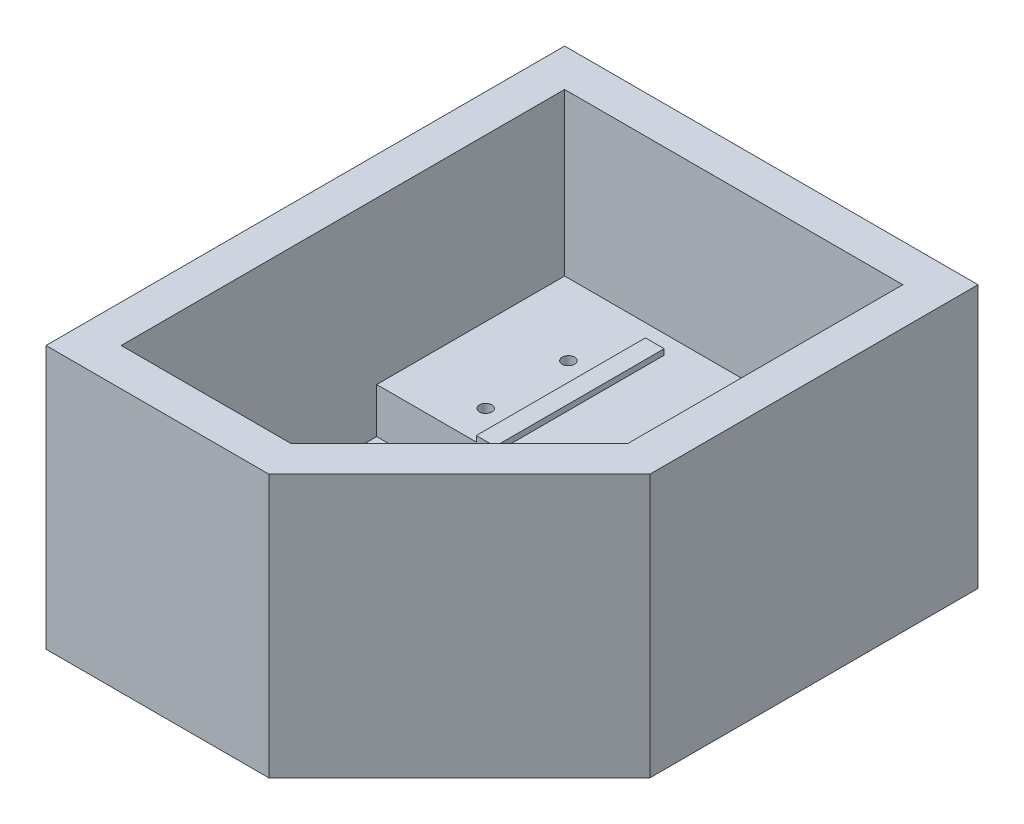
ISO-10303-21;
HEADER;
FILE_DESCRIPTION(('STEP AP214'),'2;1');
FILE_NAME('part.step','',(''),(''),'','','');
FILE_SCHEMA(('AUTOMOTIVE_DESIGN { 1 0 10303 214 1 1 1 1 }'));
ENDSEC;
DATA;
#1=APPLICATION_CONTEXT('core data for automotive mechanical design processes');
#2=APPLICATION_PROTOCOL_DEFINITION('international standard','automotive_design',2000,#1);
#3=PRODUCT_CONTEXT('',#1,'mechanical');
#4=PRODUCT('Part','Part','',(#3));
#5=PRODUCT_RELATED_PRODUCT_CATEGORY('part','',(#4));
#6=PRODUCT_DEFINITION_FORMATION('','',#4);
#7=PRODUCT_DEFINITION_CONTEXT('part definition',#1,'design');
#8=PRODUCT_DEFINITION('design','',#6,#7);
#9=PRODUCT_DEFINITION_SHAPE('','',#8);
#10=(LENGTH_UNIT() NAMED_UNIT(*) SI_UNIT(.MILLI.,.METRE.));
#11=(NAMED_UNIT(*) PLANE_ANGLE_UNIT() SI_UNIT($,.RADIAN.));
#12=(NAMED_UNIT(*) SI_UNIT($,.STERADIAN.) SOLID_ANGLE_UNIT());
#13=UNCERTAINTY_MEASURE_WITH_UNIT(LENGTH_MEASURE(1.E-05),#10,'distance_accuracy_value','');
#14=(GEOMETRIC_REPRESENTATION_CONTEXT(3) GLOBAL_UNCERTAINTY_ASSIGNED_CONTEXT((#13)) GLOBAL_UNIT_ASSIGNED_CONTEXT((#10,
#11,#12)) REPRESENTATION_CONTEXT('',''));
#15=CARTESIAN_POINT('',(0.,0.,0.));
#16=DIRECTION('',(0.,0.,1.));
#17=DIRECTION('',(1.,0.,0.));
#18=AXIS2_PLACEMENT_3D('',#15,#16,#17);
#19=CARTESIAN_POINT('',(0.,27.,0.));
#20=DIRECTION('',(0.,1.,0.));
#21=DIRECTION('',(0.,0.,1.));
#22=AXIS2_PLACEMENT_3D('',#19,#20,#21);
#23=PLANE('',#22);
#24=CARTESIAN_POINT('',(-25.,27.,-40.));
#25=DIRECTION('',(0.,1.,0.));
#26=DIRECTION('',(0.,0.,1.));
#27=AXIS2_PLACEMENT_3D('',#24,#25,#26);
#28=CIRCLE('',#27,1.64999999999999);
#29=CARTESIAN_POINT('',(-25.,27.,-38.35));
#30=VERTEX_POINT('',#29);
#31=EDGE_CURVE('E272',#30,#30,#28,.T.);
#32=ORIENTED_EDGE('',*,*,#31,.F.);
#33=EDGE_LOOP('',(#32));
#34=FACE_BOUND('',#33,.T.);
#35=CARTESIAN_POINT('',(25.,27.,-40.));
#36=DIRECTION('',(0.,1.,0.));
#37=DIRECTION('',(0.,0.,1.));
#38=AXIS2_PLACEMENT_3D('',#35,#36,#37);
#39=CIRCLE('',#38,1.64999999999999);
#40=CARTESIAN_POINT('',(25.,27.,-38.35));
#41=VERTEX_POINT('',#40);
#42=EDGE_CURVE('E278',#41,#41,#39,.T.);
#43=ORIENTED_EDGE('',*,*,#42,.F.);
#44=EDGE_LOOP('',(#43));
#45=FACE_BOUND('',#44,.T.);
#46=CARTESIAN_POINT('',(25.,27.,-18.));
#47=DIRECTION('',(0.,1.,0.));
#48=DIRECTION('',(0.,0.,1.));
#49=AXIS2_PLACEMENT_3D('',#46,#47,#48);
#50=CIRCLE('',#49,1.64999999999999);
#51=CARTESIAN_POINT('',(25.,27.,-16.35));
#52=VERTEX_POINT('',#51);
#53=EDGE_CURVE('E284',#52,#52,#50,.T.);
#54=ORIENTED_EDGE('',*,*,#53,.F.);
#55=EDGE_LOOP('',(#54));
#56=FACE_BOUND('',#55,.T.);
#57=CARTESIAN_POINT('',(-25.,27.,-18.));
#58=DIRECTION('',(0.,1.,0.));
#59=DIRECTION('',(0.,0.,1.));
#60=AXIS2_PLACEMENT_3D('',#57,#58,#59);
#61=CIRCLE('',#60,1.64999999999999);
#62=CARTESIAN_POINT('',(-25.,27.,-16.35));
#63=VERTEX_POINT('',#62);
#64=EDGE_CURVE('E290',#63,#63,#61,.T.);
#65=ORIENTED_EDGE('',*,*,#64,.F.);
#66=EDGE_LOOP('',(#65));
#67=FACE_BOUND('',#66,.T.);
#68=DIRECTION('',(-1.,0.,0.));
#69=VECTOR('',#68,1.);
#70=CARTESIAN_POINT('',(18.5,27.,-54.));
#71=LINE('',#70,#69);
#72=CARTESIAN_POINT('',(18.5,27.,-54.));
#73=VERTEX_POINT('',#72);
#74=CARTESIAN_POINT('',(13.5,27.,-54.));
#75=VERTEX_POINT('',#74);
#76=EDGE_CURVE('E56',#73,#75,#71,.T.);
#77=ORIENTED_EDGE('',*,*,#76,.F.);
#78=DIRECTION('',(0.,0.,1.));
#79=VECTOR('',#78,1.);
#80=CARTESIAN_POINT('',(18.5,27.,-54.));
#81=LINE('',#80,#79);
#82=CARTESIAN_POINT('',(18.5,27.,-9.));
#83=VERTEX_POINT('',#82);
#84=EDGE_CURVE('E311',#73,#83,#81,.T.);
#85=ORIENTED_EDGE('',*,*,#84,.T.);
#86=DIRECTION('',(1.,0.,0.));
#87=VECTOR('',#86,1.);
#88=CARTESIAN_POINT('',(-45.,27.,-9.));
#89=LINE('',#88,#87);
#90=CARTESIAN_POINT('',(45.,27.,-9.));
#91=VERTEX_POINT('',#90);
#92=EDGE_CURVE('E359',#83,#91,#89,.T.);
#93=ORIENTED_EDGE('',*,*,#92,.T.);
#94=DIRECTION('',(0.,0.,-1.));
#95=VECTOR('',#94,1.);
#96=CARTESIAN_POINT('',(45.,27.,-59.));
#97=LINE('',#96,#95);
#98=CARTESIAN_POINT('',(45.,27.,-59.));
#99=VERTEX_POINT('',#98);
#100=EDGE_CURVE('E364',#91,#99,#97,.T.);
#101=ORIENTED_EDGE('',*,*,#100,.T.);
#102=DIRECTION('',(-1.,0.,0.));
#103=VECTOR('',#102,1.);
#104=CARTESIAN_POINT('',(-45.,27.,-59.));
#105=LINE('',#104,#103);
#106=CARTESIAN_POINT('',(-45.,27.,-59.));
#107=VERTEX_POINT('',#106);
#108=EDGE_CURVE('E382',#99,#107,#105,.T.);
#109=ORIENTED_EDGE('',*,*,#108,.T.);
#110=DIRECTION('',(0.,0.,1.));
#111=VECTOR('',#110,1.);
#112=CARTESIAN_POINT('',(-45.,27.,-59.));
#113=LINE('',#112,#111);
#114=CARTESIAN_POINT('',(-45.,27.,-9.));
#115=VERTEX_POINT('',#114);
#116=EDGE_CURVE('E345',#107,#115,#113,.T.);
#117=ORIENTED_EDGE('',*,*,#116,.T.);
#118=CARTESIAN_POINT('',(-18.5,27.,-9.));
#119=VERTEX_POINT('',#118);
#120=EDGE_CURVE('E370',#115,#119,#89,.T.);
#121=ORIENTED_EDGE('',*,*,#120,.T.);
#122=DIRECTION('',(0.,0.,1.));
#123=VECTOR('',#122,1.);
#124=CARTESIAN_POINT('',(-18.5,27.,-54.));
#125=LINE('',#124,#123);
#126=CARTESIAN_POINT('',(-18.5,27.,-54.));
#127=VERTEX_POINT('',#126);
#128=EDGE_CURVE('E333',#127,#119,#125,.T.);
#129=ORIENTED_EDGE('',*,*,#128,.F.);
#130=DIRECTION('',(1.,0.,0.));
#131=VECTOR('',#130,1.);
#132=CARTESIAN_POINT('',(-18.5,27.,-54.));
#133=LINE('',#132,#131);
#134=CARTESIAN_POINT('',(-13.5,27.,-54.));
#135=VERTEX_POINT('',#134);
#136=EDGE_CURVE('E323',#127,#135,#133,.T.);
#137=ORIENTED_EDGE('',*,*,#136,.T.);
#138=DIRECTION('',(0.,0.,1.));
#139=VECTOR('',#138,1.);
#140=CARTESIAN_POINT('',(-13.5,27.,-54.));
#141=LINE('',#140,#139);
#142=CARTESIAN_POINT('',(-13.5,27.,-9.));
#143=VERTEX_POINT('',#142);
#144=EDGE_CURVE('E342',#135,#143,#141,.T.);
#145=ORIENTED_EDGE('',*,*,#144,.T.);
#146=CARTESIAN_POINT('',(13.5,27.,-9.));
#147=VERTEX_POINT('',#146);
#148=EDGE_CURVE('E361',#143,#147,#89,.T.);
#149=ORIENTED_EDGE('',*,*,#148,.T.);
#150=DIRECTION('',(0.,0.,1.));
#151=VECTOR('',#150,1.);
#152=CARTESIAN_POINT('',(13.5,27.,-54.));
#153=LINE('',#152,#151);
#154=EDGE_CURVE('E61',#75,#147,#153,.T.);
#155=ORIENTED_EDGE('',*,*,#154,.F.);
#156=EDGE_LOOP('',(#77,#85,#93,#101,#109,#117,#121,#129,#137,#145,#149,#155));
#157=FACE_BOUND('',#156,.T.);
#158=ADVANCED_FACE('F38',(#34,#45,#56,#67,#157),#23,.T.);
#159=CARTESIAN_POINT('',(0.,15.,0.));
#160=DIRECTION('',(0.,-1.,0.));
#161=DIRECTION('',(0.,0.,-1.));
#162=AXIS2_PLACEMENT_3D('',#159,#160,#161);
#163=PLANE('',#162);
#164=DIRECTION('',(1.,0.,0.));
#165=VECTOR('',#164,1.);
#166=CARTESIAN_POINT('',(-45.,15.,59.));
#167=LINE('',#166,#165);
#168=CARTESIAN_POINT('',(-45.,15.,59.));
#169=VERTEX_POINT('',#168);
#170=CARTESIAN_POINT('',(0.182522167130448,15.,59.));
#171=VERTEX_POINT('',#170);
#172=EDGE_CURVE('E12',#169,#171,#167,.T.);
#173=ORIENTED_EDGE('',*,*,#172,.T.);
#174=DIRECTION('',(0.707106781186551,0.,-0.707106781186544));
#175=VECTOR('',#174,1.);
#176=CARTESIAN_POINT('',(29.5912610835652,15.,29.5912610835655));
#177=LINE('',#176,#175);
#178=CARTESIAN_POINT('',(45.,15.,14.1825221671309));
#179=VERTEX_POINT('',#178);
#180=EDGE_CURVE('E263',#171,#179,#177,.T.);
#181=ORIENTED_EDGE('',*,*,#180,.T.);
#182=DIRECTION('',(0.,0.,-1.));
#183=VECTOR('',#182,1.);
#184=CARTESIAN_POINT('',(45.,15.,59.));
#185=LINE('',#184,#183);
#186=CARTESIAN_POINT('',(45.,15.,-9.));
#187=VERTEX_POINT('',#186);
#188=EDGE_CURVE('E42',#179,#187,#185,.T.);
#189=ORIENTED_EDGE('',*,*,#188,.T.);
#190=DIRECTION('',(1.,0.,0.));
#191=VECTOR('',#190,1.);
#192=CARTESIAN_POINT('',(-45.,15.,-9.));
#193=LINE('',#192,#191);
#194=CARTESIAN_POINT('',(-45.,15.,-9.));
#195=VERTEX_POINT('',#194);
#196=EDGE_CURVE('E339',#195,#187,#193,.T.);
#197=ORIENTED_EDGE('',*,*,#196,.F.);
#198=DIRECTION('',(0.,0.,1.));
#199=VECTOR('',#198,1.);
#200=CARTESIAN_POINT('',(-45.,15.,59.));
#201=LINE('',#200,#199);
#202=EDGE_CURVE('E48',#195,#169,#201,.T.);
#203=ORIENTED_EDGE('',*,*,#202,.T.);
#204=EDGE_LOOP('',(#173,#181,#189,#197,#203));
#205=FACE_BOUND('',#204,.T.);
#206=ADVANCED_FACE('F438',(#205),#163,.F.);
#207=CARTESIAN_POINT('',(-45.,27.,-9.));
#208=DIRECTION('',(0.,0.,-1.));
#209=DIRECTION('',(-1.,0.,0.));
#210=AXIS2_PLACEMENT_3D('',#207,#208,#209);
#211=PLANE('',#210);
#212=ORIENTED_EDGE('',*,*,#196,.T.);
#213=DIRECTION('',(0.,-1.,0.));
#214=VECTOR('',#213,1.);
#215=CARTESIAN_POINT('',(45.,27.,-9.));
#216=LINE('',#215,#214);
#217=EDGE_CURVE('E378',#91,#187,#216,.T.);
#218=ORIENTED_EDGE('',*,*,#217,.F.);
#219=ORIENTED_EDGE('',*,*,#92,.F.);
#220=DIRECTION('',(0.,-1.,0.));
#221=VECTOR('',#220,1.);
#222=CARTESIAN_POINT('',(18.5,28.5,-9.));
#223=LINE('',#222,#221);
#224=CARTESIAN_POINT('',(18.5,28.5,-9.));
#225=VERTEX_POINT('',#224);
#226=EDGE_CURVE('E296',#225,#83,#223,.T.);
#227=ORIENTED_EDGE('',*,*,#226,.F.);
#228=DIRECTION('',(1.,0.,0.));
#229=VECTOR('',#228,1.);
#230=CARTESIAN_POINT('',(18.5,28.5,-9.));
#231=LINE('',#230,#229);
#232=CARTESIAN_POINT('',(13.5,28.5,-9.));
#233=VERTEX_POINT('',#232);
#234=EDGE_CURVE('E308',#233,#225,#231,.T.);
#235=ORIENTED_EDGE('',*,*,#234,.F.);
#236=DIRECTION('',(0.,1.,0.));
#237=VECTOR('',#236,1.);
#238=CARTESIAN_POINT('',(13.5,28.5,-9.));
#239=LINE('',#238,#237);
#240=EDGE_CURVE('E300',#147,#233,#239,.T.);
#241=ORIENTED_EDGE('',*,*,#240,.F.);
#242=ORIENTED_EDGE('',*,*,#148,.F.);
#243=DIRECTION('',(0.,1.,0.));
#244=VECTOR('',#243,1.);
#245=CARTESIAN_POINT('',(-13.5,28.5,-9.));
#246=LINE('',#245,#244);
#247=CARTESIAN_POINT('',(-13.5,28.5,-9.));
#248=VERTEX_POINT('',#247);
#249=EDGE_CURVE('E336',#143,#248,#246,.T.);
#250=ORIENTED_EDGE('',*,*,#249,.T.);
#251=DIRECTION('',(-1.,0.,0.));
#252=VECTOR('',#251,1.);
#253=CARTESIAN_POINT('',(-18.5,28.5,-9.));
#254=LINE('',#253,#252);
#255=CARTESIAN_POINT('',(-18.5,28.5,-9.));
#256=VERTEX_POINT('',#255);
#257=EDGE_CURVE('E324',#248,#256,#254,.T.);
#258=ORIENTED_EDGE('',*,*,#257,.T.);
#259=DIRECTION('',(0.,-1.,0.));
#260=VECTOR('',#259,1.);
#261=CARTESIAN_POINT('',(-18.5,28.5,-9.));
#262=LINE('',#261,#260);
#263=EDGE_CURVE('E313',#256,#119,#262,.T.);
#264=ORIENTED_EDGE('',*,*,#263,.T.);
#265=ORIENTED_EDGE('',*,*,#120,.F.);
#266=DIRECTION('',(0.,-1.,0.));
#267=VECTOR('',#266,1.);
#268=CARTESIAN_POINT('',(-45.,27.,-9.));
#269=LINE('',#268,#267);
#270=EDGE_CURVE('E375',#115,#195,#269,.T.);
#271=ORIENTED_EDGE('',*,*,#270,.T.);
#272=EDGE_LOOP('',(#212,#218,#219,#227,#235,#241,#242,#250,#258,#264,#265,#271));
#273=FACE_BOUND('',#272,.T.);
#274=ADVANCED_FACE('F402',(#273),#211,.F.);
#275=CARTESIAN_POINT('',(-18.5,28.5,-54.));
#276=DIRECTION('',(-1.,0.,0.));
#277=DIRECTION('',(0.,0.,1.));
#278=AXIS2_PLACEMENT_3D('',#275,#276,#277);
#279=PLANE('',#278);
#280=ORIENTED_EDGE('',*,*,#263,.F.);
#281=DIRECTION('',(0.,0.,1.));
#282=VECTOR('',#281,1.);
#283=CARTESIAN_POINT('',(-18.5,28.5,-54.));
#284=LINE('',#283,#282);
#285=CARTESIAN_POINT('',(-18.5,28.5,-54.));
#286=VERTEX_POINT('',#285);
#287=EDGE_CURVE('E337',#286,#256,#284,.T.);
#288=ORIENTED_EDGE('',*,*,#287,.F.);
#289=DIRECTION('',(0.,-1.,0.));
#290=VECTOR('',#289,1.);
#291=CARTESIAN_POINT('',(-18.5,28.5,-54.));
#292=LINE('',#291,#290);
#293=EDGE_CURVE('E320',#286,#127,#292,.T.);
#294=ORIENTED_EDGE('',*,*,#293,.T.);
#295=ORIENTED_EDGE('',*,*,#128,.T.);
#296=EDGE_LOOP('',(#280,#288,#294,#295));
#297=FACE_BOUND('',#296,.T.);
#298=ADVANCED_FACE('F407',(#297),#279,.T.);
#299=CARTESIAN_POINT('',(-18.5,28.5,-54.));
#300=DIRECTION('',(0.,1.,0.));
#301=DIRECTION('',(0.,0.,1.));
#302=AXIS2_PLACEMENT_3D('',#299,#300,#301);
#303=PLANE('',#302);
#304=ORIENTED_EDGE('',*,*,#257,.F.);
#305=DIRECTION('',(0.,0.,1.));
#306=VECTOR('',#305,1.);
#307=CARTESIAN_POINT('',(-13.5,28.5,-54.));
#308=LINE('',#307,#306);
#309=CARTESIAN_POINT('',(-13.5,28.5,-54.));
#310=VERTEX_POINT('',#309);
#311=EDGE_CURVE('E340',#310,#248,#308,.T.);
#312=ORIENTED_EDGE('',*,*,#311,.F.);
#313=DIRECTION('',(-1.,0.,0.));
#314=VECTOR('',#313,1.);
#315=CARTESIAN_POINT('',(-18.5,28.5,-54.));
#316=LINE('',#315,#314);
#317=EDGE_CURVE('E330',#310,#286,#316,.T.);
#318=ORIENTED_EDGE('',*,*,#317,.T.);
#319=ORIENTED_EDGE('',*,*,#287,.T.);
#320=EDGE_LOOP('',(#304,#312,#318,#319));
#321=FACE_BOUND('',#320,.T.);
#322=ADVANCED_FACE('F414',(#321),#303,.T.);
#323=CARTESIAN_POINT('',(-13.5,28.5,-54.));
#324=DIRECTION('',(1.,0.,0.));
#325=DIRECTION('',(0.,0.,-1.));
#326=AXIS2_PLACEMENT_3D('',#323,#324,#325);
#327=PLANE('',#326);
#328=ORIENTED_EDGE('',*,*,#249,.F.);
#329=ORIENTED_EDGE('',*,*,#144,.F.);
#330=DIRECTION('',(0.,1.,0.));
#331=VECTOR('',#330,1.);
#332=CARTESIAN_POINT('',(-13.5,28.5,-54.));
#333=LINE('',#332,#331);
#334=EDGE_CURVE('E327',#135,#310,#333,.T.);
#335=ORIENTED_EDGE('',*,*,#334,.T.);
#336=ORIENTED_EDGE('',*,*,#311,.T.);
#337=EDGE_LOOP('',(#328,#329,#335,#336));
#338=FACE_BOUND('',#337,.T.);
#339=ADVANCED_FACE('F416',(#338),#327,.T.);
#340=CARTESIAN_POINT('',(0.,0.,-54.));
#341=DIRECTION('',(0.,0.,1.));
#342=DIRECTION('',(1.,0.,0.));
#343=AXIS2_PLACEMENT_3D('',#340,#341,#342);
#344=PLANE('',#343);
#345=ORIENTED_EDGE('',*,*,#293,.F.);
#346=ORIENTED_EDGE('',*,*,#317,.F.);
#347=ORIENTED_EDGE('',*,*,#334,.F.);
#348=ORIENTED_EDGE('',*,*,#136,.F.);
#349=EDGE_LOOP('',(#345,#346,#347,#348));
#350=FACE_BOUND('',#349,.T.);
#351=ADVANCED_FACE('F411',(#350),#344,.F.);
#352=CARTESIAN_POINT('',(18.5,28.5,-54.));
#353=DIRECTION('',(-1.,0.,0.));
#354=DIRECTION('',(0.,0.,1.));
#355=AXIS2_PLACEMENT_3D('',#352,#353,#354);
#356=PLANE('',#355);
#357=ORIENTED_EDGE('',*,*,#226,.T.);
#358=ORIENTED_EDGE('',*,*,#84,.F.);
#359=DIRECTION('',(0.,-1.,0.));
#360=VECTOR('',#359,1.);
#361=CARTESIAN_POINT('',(18.5,28.5,-54.));
#362=LINE('',#361,#360);
#363=CARTESIAN_POINT('',(18.5,28.5,-54.));
#364=VERTEX_POINT('',#363);
#365=EDGE_CURVE('E297',#364,#73,#362,.T.);
#366=ORIENTED_EDGE('',*,*,#365,.F.);
#367=DIRECTION('',(0.,0.,1.));
#368=VECTOR('',#367,1.);
#369=CARTESIAN_POINT('',(18.5,28.5,-54.));
#370=LINE('',#369,#368);
#371=EDGE_CURVE('E305',#364,#225,#370,.T.);
#372=ORIENTED_EDGE('',*,*,#371,.T.);
#373=EDGE_LOOP('',(#357,#358,#366,#372));
#374=FACE_BOUND('',#373,.T.);
#375=ADVANCED_FACE('F434',(#374),#356,.F.);
#376=CARTESIAN_POINT('',(13.5,28.5,-54.));
#377=DIRECTION('',(1.,0.,0.));
#378=DIRECTION('',(0.,0.,-1.));
#379=AXIS2_PLACEMENT_3D('',#376,#377,#378);
#380=PLANE('',#379);
#381=ORIENTED_EDGE('',*,*,#240,.T.);
#382=DIRECTION('',(0.,0.,1.));
#383=VECTOR('',#382,1.);
#384=CARTESIAN_POINT('',(13.5,28.5,-54.));
#385=LINE('',#384,#383);
#386=CARTESIAN_POINT('',(13.5,28.5,-54.));
#387=VERTEX_POINT('',#386);
#388=EDGE_CURVE('E315',#387,#233,#385,.T.);
#389=ORIENTED_EDGE('',*,*,#388,.F.);
#390=DIRECTION('',(0.,1.,0.));
#391=VECTOR('',#390,1.);
#392=CARTESIAN_POINT('',(13.5,28.5,-54.));
#393=LINE('',#392,#391);
#394=EDGE_CURVE('E302',#75,#387,#393,.T.);
#395=ORIENTED_EDGE('',*,*,#394,.F.);
#396=ORIENTED_EDGE('',*,*,#154,.T.);
#397=EDGE_LOOP('',(#381,#389,#395,#396));
#398=FACE_BOUND('',#397,.T.);
#399=ADVANCED_FACE('F423',(#398),#380,.F.);
#400=CARTESIAN_POINT('',(18.5,28.5,-54.));
#401=DIRECTION('',(0.,-1.,0.));
#402=DIRECTION('',(0.,0.,-1.));
#403=AXIS2_PLACEMENT_3D('',#400,#401,#402);
#404=PLANE('',#403);
#405=ORIENTED_EDGE('',*,*,#234,.T.);
#406=ORIENTED_EDGE('',*,*,#371,.F.);
#407=DIRECTION('',(1.,0.,0.));
#408=VECTOR('',#407,1.);
#409=CARTESIAN_POINT('',(18.5,28.5,-54.));
#410=LINE('',#409,#408);
#411=EDGE_CURVE('E299',#387,#364,#410,.T.);
#412=ORIENTED_EDGE('',*,*,#411,.F.);
#413=ORIENTED_EDGE('',*,*,#388,.T.);
#414=EDGE_LOOP('',(#405,#406,#412,#413));
#415=FACE_BOUND('',#414,.T.);
#416=ADVANCED_FACE('F427',(#415),#404,.F.);
#417=CARTESIAN_POINT('',(0.,0.,-54.));
#418=DIRECTION('',(0.,0.,1.));
#419=DIRECTION('',(-1.,0.,0.));
#420=AXIS2_PLACEMENT_3D('',#417,#418,#419);
#421=PLANE('',#420);
#422=ORIENTED_EDGE('',*,*,#365,.T.);
#423=ORIENTED_EDGE('',*,*,#76,.T.);
#424=ORIENTED_EDGE('',*,*,#394,.T.);
#425=ORIENTED_EDGE('',*,*,#411,.T.);
#426=EDGE_LOOP('',(#422,#423,#424,#425));
#427=FACE_BOUND('',#426,.T.);
#428=ADVANCED_FACE('F431',(#427),#421,.F.);
#429=CARTESIAN_POINT('',(-25.,20.396,-18.));
#430=DIRECTION('',(0.,1.,0.));
#431=DIRECTION('',(0.,0.,1.));
#432=AXIS2_PLACEMENT_3D('',#429,#430,#431);
#433=CONICAL_SURFACE('',#432,1.65,1.02974425867665);
#434=CARTESIAN_POINT('',(-25.,19.4045799786045,-18.));
#435=VERTEX_POINT('',#434);
#436=VERTEX_LOOP('',#435);
#437=FACE_BOUND('',#436,.T.);
#438=CARTESIAN_POINT('',(-25.,20.396,-18.));
#439=DIRECTION('',(0.,1.,0.));
#440=DIRECTION('',(0.,0.,1.));
#441=AXIS2_PLACEMENT_3D('',#438,#439,#440);
#442=CIRCLE('',#441,1.65);
#443=CARTESIAN_POINT('',(-25.,20.396,-16.35));
#444=VERTEX_POINT('',#443);
#445=EDGE_CURVE('E293',#444,#444,#442,.T.);
#446=ORIENTED_EDGE('',*,*,#445,.T.);
#447=EDGE_LOOP('',(#446));
#448=FACE_BOUND('',#447,.T.);
#449=ADVANCED_FACE('F487',(#437,#448),#433,.F.);
#450=CARTESIAN_POINT('',(-25.,27.,-18.));
#451=DIRECTION('',(0.,1.,0.));
#452=DIRECTION('',(0.,0.,1.));
#453=AXIS2_PLACEMENT_3D('',#450,#451,#452);
#454=CYLINDRICAL_SURFACE('',#453,1.64999999999999);
#455=ORIENTED_EDGE('',*,*,#445,.F.);
#456=EDGE_LOOP('',(#455));
#457=FACE_BOUND('',#456,.T.);
#458=ORIENTED_EDGE('',*,*,#64,.T.);
#459=EDGE_LOOP('',(#458));
#460=FACE_BOUND('',#459,.T.);
#461=ADVANCED_FACE('F490',(#457,#460),#454,.F.);
#462=CARTESIAN_POINT('',(25.,20.396,-18.));
#463=DIRECTION('',(0.,1.,0.));
#464=DIRECTION('',(0.,0.,1.));
#465=AXIS2_PLACEMENT_3D('',#462,#463,#464);
#466=CONICAL_SURFACE('',#465,1.65,1.02974425867665);
#467=CARTESIAN_POINT('',(25.,19.4045799786045,-18.));
#468=VERTEX_POINT('',#467);
#469=VERTEX_LOOP('',#468);
#470=FACE_BOUND('',#469,.T.);
#471=CARTESIAN_POINT('',(25.,20.396,-18.));
#472=DIRECTION('',(0.,1.,0.));
#473=DIRECTION('',(0.,0.,1.));
#474=AXIS2_PLACEMENT_3D('',#471,#472,#473);
#475=CIRCLE('',#474,1.65);
#476=CARTESIAN_POINT('',(25.,20.396,-16.35));
#477=VERTEX_POINT('',#476);
#478=EDGE_CURVE('E287',#477,#477,#475,.T.);
#479=ORIENTED_EDGE('',*,*,#478,.T.);
#480=EDGE_LOOP('',(#479));
#481=FACE_BOUND('',#480,.T.);
#482=ADVANCED_FACE('F494',(#470,#481),#466,.F.);
#483=CARTESIAN_POINT('',(25.,27.,-18.));
#484=DIRECTION('',(0.,1.,0.));
#485=DIRECTION('',(0.,0.,1.));
#486=AXIS2_PLACEMENT_3D('',#483,#484,#485);
#487=CYLINDRICAL_SURFACE('',#486,1.65);
#488=ORIENTED_EDGE('',*,*,#478,.F.);
#489=EDGE_LOOP('',(#488));
#490=FACE_BOUND('',#489,.T.);
#491=ORIENTED_EDGE('',*,*,#53,.T.);
#492=EDGE_LOOP('',(#491));
#493=FACE_BOUND('',#492,.T.);
#494=ADVANCED_FACE('F498',(#490,#493),#487,.F.);
#495=CARTESIAN_POINT('',(25.,20.396,-40.));
#496=DIRECTION('',(0.,1.,0.));
#497=DIRECTION('',(0.,0.,1.));
#498=AXIS2_PLACEMENT_3D('',#495,#496,#497);
#499=CONICAL_SURFACE('',#498,1.65,1.02974425867665);
#500=CARTESIAN_POINT('',(25.,19.4045799786045,-40.));
#501=VERTEX_POINT('',#500);
#502=VERTEX_LOOP('',#501);
#503=FACE_BOUND('',#502,.T.);
#504=CARTESIAN_POINT('',(25.,20.396,-40.));
#505=DIRECTION('',(0.,1.,0.));
#506=DIRECTION('',(0.,0.,1.));
#507=AXIS2_PLACEMENT_3D('',#504,#505,#506);
#508=CIRCLE('',#507,1.65);
#509=CARTESIAN_POINT('',(25.,20.396,-38.35));
#510=VERTEX_POINT('',#509);
#511=EDGE_CURVE('E281',#510,#510,#508,.T.);
#512=ORIENTED_EDGE('',*,*,#511,.T.);
#513=EDGE_LOOP('',(#512));
#514=FACE_BOUND('',#513,.T.);
#515=ADVANCED_FACE('F502',(#503,#514),#499,.F.);
#516=CARTESIAN_POINT('',(25.,27.,-40.));
#517=DIRECTION('',(0.,1.,0.));
#518=DIRECTION('',(0.,0.,1.));
#519=AXIS2_PLACEMENT_3D('',#516,#517,#518);
#520=CYLINDRICAL_SURFACE('',#519,1.64999999999999);
#521=ORIENTED_EDGE('',*,*,#511,.F.);
#522=EDGE_LOOP('',(#521));
#523=FACE_BOUND('',#522,.T.);
#524=ORIENTED_EDGE('',*,*,#42,.T.);
#525=EDGE_LOOP('',(#524));
#526=FACE_BOUND('',#525,.T.);
#527=ADVANCED_FACE('F506',(#523,#526),#520,.F.);
#528=CARTESIAN_POINT('',(-25.,20.396,-40.));
#529=DIRECTION('',(0.,1.,0.));
#530=DIRECTION('',(0.,0.,1.));
#531=AXIS2_PLACEMENT_3D('',#528,#529,#530);
#532=CONICAL_SURFACE('',#531,1.65,1.02974425867665);
#533=CARTESIAN_POINT('',(-25.,19.4045799786045,-40.));
#534=VERTEX_POINT('',#533);
#535=VERTEX_LOOP('',#534);
#536=FACE_BOUND('',#535,.T.);
#537=CARTESIAN_POINT('',(-25.,20.396,-40.));
#538=DIRECTION('',(0.,1.,0.));
#539=DIRECTION('',(0.,0.,1.));
#540=AXIS2_PLACEMENT_3D('',#537,#538,#539);
#541=CIRCLE('',#540,1.65);
#542=CARTESIAN_POINT('',(-25.,20.396,-38.35));
#543=VERTEX_POINT('',#542);
#544=EDGE_CURVE('E275',#543,#543,#541,.T.);
#545=ORIENTED_EDGE('',*,*,#544,.T.);
#546=EDGE_LOOP('',(#545));
#547=FACE_BOUND('',#546,.T.);
#548=ADVANCED_FACE('F510',(#536,#547),#532,.F.);
#549=CARTESIAN_POINT('',(-25.,27.,-40.));
#550=DIRECTION('',(0.,1.,0.));
#551=DIRECTION('',(0.,0.,1.));
#552=AXIS2_PLACEMENT_3D('',#549,#550,#551);
#553=CYLINDRICAL_SURFACE('',#552,1.64999999999999);
#554=ORIENTED_EDGE('',*,*,#544,.F.);
#555=EDGE_LOOP('',(#554));
#556=FACE_BOUND('',#555,.T.);
#557=ORIENTED_EDGE('',*,*,#31,.T.);
#558=EDGE_LOOP('',(#557));
#559=FACE_BOUND('',#558,.T.);
#560=ADVANCED_FACE('F451',(#556,#559),#553,.F.);
#561=CARTESIAN_POINT('',(45.,70.,14.1825221671309));
#562=DIRECTION('',(0.707106781186544,0.,0.707106781186551));
#563=DIRECTION('',(0.707106781186551,0.,-0.707106781186544));
#564=AXIS2_PLACEMENT_3D('',#561,#562,#563);
#565=PLANE('',#564);
#566=DIRECTION('',(0.,-1.,0.));
#567=VECTOR('',#566,1.);
#568=CARTESIAN_POINT('',(45.,70.,14.1825221671309));
#569=LINE('',#568,#567);
#570=CARTESIAN_POINT('',(45.,70.,14.1825221671309));
#571=VERTEX_POINT('',#570);
#572=EDGE_CURVE('E189',#571,#179,#569,.T.);
#573=ORIENTED_EDGE('',*,*,#572,.T.);
#574=ORIENTED_EDGE('',*,*,#180,.F.);
#575=DIRECTION('',(0.,-1.,0.));
#576=VECTOR('',#575,1.);
#577=CARTESIAN_POINT('',(0.182522167130448,70.,59.));
#578=LINE('',#577,#576);
#579=CARTESIAN_POINT('',(0.182522167130446,70.,59.));
#580=VERTEX_POINT('',#579);
#581=EDGE_CURVE('E199',#580,#171,#578,.T.);
#582=ORIENTED_EDGE('',*,*,#581,.F.);
#583=DIRECTION('',(-0.707106781186551,0.,0.707106781186544));
#584=VECTOR('',#583,1.);
#585=CARTESIAN_POINT('',(45.,70.,14.1825221671309));
#586=LINE('',#585,#584);
#587=EDGE_CURVE('E204',#571,#580,#586,.T.);
#588=ORIENTED_EDGE('',*,*,#587,.F.);
#589=EDGE_LOOP('',(#573,#574,#582,#588));
#590=FACE_BOUND('',#589,.T.);
#591=ADVANCED_FACE('F205',(#590),#565,.F.);
#592=CARTESIAN_POINT('',(0.182522167130448,70.,59.));
#593=DIRECTION('',(0.,0.,1.));
#594=DIRECTION('',(1.,0.,0.));
#595=AXIS2_PLACEMENT_3D('',#592,#593,#594);
#596=PLANE('',#595);
#597=ORIENTED_EDGE('',*,*,#581,.T.);
#598=ORIENTED_EDGE('',*,*,#172,.F.);
#599=DIRECTION('',(0.,-1.,0.));
#600=VECTOR('',#599,1.);
#601=CARTESIAN_POINT('',(-45.,70.,59.));
#602=LINE('',#601,#600);
#603=CARTESIAN_POINT('',(-45.,70.,59.));
#604=VERTEX_POINT('',#603);
#605=EDGE_CURVE('E227',#604,#169,#602,.T.);
#606=ORIENTED_EDGE('',*,*,#605,.F.);
#607=DIRECTION('',(-1.,0.,0.));
#608=VECTOR('',#607,1.);
#609=CARTESIAN_POINT('',(0.182522167130448,70.,59.));
#610=LINE('',#609,#608);
#611=EDGE_CURVE('E209',#580,#604,#610,.T.);
#612=ORIENTED_EDGE('',*,*,#611,.F.);
#613=EDGE_LOOP('',(#597,#598,#606,#612));
#614=FACE_BOUND('',#613,.T.);
#615=ADVANCED_FACE('F440',(#614),#596,.F.);
#616=CARTESIAN_POINT('',(55.,70.,-69.));
#617=DIRECTION('',(1.,0.,0.));
#618=DIRECTION('',(0.,0.,-1.));
#619=AXIS2_PLACEMENT_3D('',#616,#617,#618);
#620=PLANE('',#619);
#621=DIRECTION('',(0.,0.,1.));
#622=VECTOR('',#621,1.);
#623=CARTESIAN_POINT('',(55.,0.,-69.));
#624=LINE('',#623,#622);
#625=CARTESIAN_POINT('',(55.,0.,-69.));
#626=VERTEX_POINT('',#625);
#627=CARTESIAN_POINT('',(55.,0.,18.3246577908619));
#628=VERTEX_POINT('',#627);
#629=EDGE_CURVE('E223',#626,#628,#624,.T.);
#630=ORIENTED_EDGE('',*,*,#629,.F.);
#631=DIRECTION('',(0.,-1.,0.));
#632=VECTOR('',#631,1.);
#633=CARTESIAN_POINT('',(55.,70.,-69.));
#634=LINE('',#633,#632);
#635=CARTESIAN_POINT('',(55.,70.,-69.));
#636=VERTEX_POINT('',#635);
#637=EDGE_CURVE('E261',#636,#626,#634,.T.);
#638=ORIENTED_EDGE('',*,*,#637,.F.);
#639=DIRECTION('',(0.,0.,1.));
#640=VECTOR('',#639,1.);
#641=CARTESIAN_POINT('',(55.,70.,-69.));
#642=LINE('',#641,#640);
#643=CARTESIAN_POINT('',(55.,70.,18.3246577908619));
#644=VERTEX_POINT('',#643);
#645=EDGE_CURVE('E231',#636,#644,#642,.T.);
#646=ORIENTED_EDGE('',*,*,#645,.T.);
#647=DIRECTION('',(0.,-1.,0.));
#648=VECTOR('',#647,1.);
#649=CARTESIAN_POINT('',(55.,70.,18.3246577908619));
#650=LINE('',#649,#648);
#651=EDGE_CURVE('E247',#644,#628,#650,.T.);
#652=ORIENTED_EDGE('',*,*,#651,.T.);
#653=EDGE_LOOP('',(#630,#638,#646,#652));
#654=FACE_BOUND('',#653,.T.);
#655=ADVANCED_FACE('F442',(#654),#620,.T.);
#656=CARTESIAN_POINT('',(-55.,70.,-69.));
#657=DIRECTION('',(0.,0.,-1.));
#658=DIRECTION('',(-1.,0.,0.));
#659=AXIS2_PLACEMENT_3D('',#656,#657,#658);
#660=PLANE('',#659);
#661=DIRECTION('',(1.,0.,0.));
#662=VECTOR('',#661,1.);
#663=CARTESIAN_POINT('',(-55.,0.,-69.));
#664=LINE('',#663,#662);
#665=CARTESIAN_POINT('',(-55.,0.,-69.));
#666=VERTEX_POINT('',#665);
#667=EDGE_CURVE('E235',#666,#626,#664,.T.);
#668=ORIENTED_EDGE('',*,*,#667,.F.);
#669=DIRECTION('',(0.,-1.,0.));
#670=VECTOR('',#669,1.);
#671=CARTESIAN_POINT('',(-55.,70.,-69.));
#672=LINE('',#671,#670);
#673=CARTESIAN_POINT('',(-55.,70.,-69.));
#674=VERTEX_POINT('',#673);
#675=EDGE_CURVE('E264',#674,#666,#672,.T.);
#676=ORIENTED_EDGE('',*,*,#675,.F.);
#677=DIRECTION('',(1.,0.,0.));
#678=VECTOR('',#677,1.);
#679=CARTESIAN_POINT('',(-55.,70.,-69.));
#680=LINE('',#679,#678);
#681=EDGE_CURVE('E244',#674,#636,#680,.T.);
#682=ORIENTED_EDGE('',*,*,#681,.T.);
#683=ORIENTED_EDGE('',*,*,#637,.T.);
#684=EDGE_LOOP('',(#668,#676,#682,#683));
#685=FACE_BOUND('',#684,.T.);
#686=ADVANCED_FACE('F448',(#685),#660,.T.);
#687=CARTESIAN_POINT('',(-55.,70.,69.));
#688=DIRECTION('',(-1.,0.,0.));
#689=DIRECTION('',(0.,0.,1.));
#690=AXIS2_PLACEMENT_3D('',#687,#688,#689);
#691=PLANE('',#690);
#692=DIRECTION('',(0.,0.,-1.));
#693=VECTOR('',#692,1.);
#694=CARTESIAN_POINT('',(-55.,0.,69.));
#695=LINE('',#694,#693);
#696=CARTESIAN_POINT('',(-55.,0.,69.));
#697=VERTEX_POINT('',#696);
#698=EDGE_CURVE('E256',#697,#666,#695,.T.);
#699=ORIENTED_EDGE('',*,*,#698,.F.);
#700=DIRECTION('',(0.,-1.,0.));
#701=VECTOR('',#700,1.);
#702=CARTESIAN_POINT('',(-55.,70.,69.));
#703=LINE('',#702,#701);
#704=CARTESIAN_POINT('',(-55.,70.,69.));
#705=VERTEX_POINT('',#704);
#706=EDGE_CURVE('E266',#705,#697,#703,.T.);
#707=ORIENTED_EDGE('',*,*,#706,.F.);
#708=DIRECTION('',(0.,0.,-1.));
#709=VECTOR('',#708,1.);
#710=CARTESIAN_POINT('',(-55.,70.,69.));
#711=LINE('',#710,#709);
#712=EDGE_CURVE('E241',#705,#674,#711,.T.);
#713=ORIENTED_EDGE('',*,*,#712,.T.);
#714=ORIENTED_EDGE('',*,*,#675,.T.);
#715=EDGE_LOOP('',(#699,#707,#713,#714));
#716=FACE_BOUND('',#715,.T.);
#717=ADVANCED_FACE('F525',(#716),#691,.T.);
#718=CARTESIAN_POINT('',(4.32465779086138,70.,69.));
#719=DIRECTION('',(0.,0.,1.));
#720=DIRECTION('',(1.,0.,0.));
#721=AXIS2_PLACEMENT_3D('',#718,#719,#720);
#722=PLANE('',#721);
#723=DIRECTION('',(-1.,0.,0.));
#724=VECTOR('',#723,1.);
#725=CARTESIAN_POINT('',(4.32465779086138,0.,69.));
#726=LINE('',#725,#724);
#727=CARTESIAN_POINT('',(4.32465779086138,0.,69.));
#728=VERTEX_POINT('',#727);
#729=EDGE_CURVE('E253',#728,#697,#726,.T.);
#730=ORIENTED_EDGE('',*,*,#729,.F.);
#731=DIRECTION('',(0.,-1.,0.));
#732=VECTOR('',#731,1.);
#733=CARTESIAN_POINT('',(4.32465779086138,70.,69.));
#734=LINE('',#733,#732);
#735=CARTESIAN_POINT('',(4.32465779086138,70.,69.));
#736=VERTEX_POINT('',#735);
#737=EDGE_CURVE('E268',#736,#728,#734,.T.);
#738=ORIENTED_EDGE('',*,*,#737,.F.);
#739=DIRECTION('',(-1.,0.,0.));
#740=VECTOR('',#739,1.);
#741=CARTESIAN_POINT('',(4.32465779086138,70.,69.));
#742=LINE('',#741,#740);
#743=EDGE_CURVE('E238',#736,#705,#742,.T.);
#744=ORIENTED_EDGE('',*,*,#743,.T.);
#745=ORIENTED_EDGE('',*,*,#706,.T.);
#746=EDGE_LOOP('',(#730,#738,#744,#745));
#747=FACE_BOUND('',#746,.T.);
#748=ADVANCED_FACE('F521',(#747),#722,.T.);
#749=CARTESIAN_POINT('',(55.,70.,18.3246577908619));
#750=DIRECTION('',(0.707106781186544,0.,0.707106781186551));
#751=DIRECTION('',(0.707106781186551,0.,-0.707106781186544));
#752=AXIS2_PLACEMENT_3D('',#749,#750,#751);
#753=PLANE('',#752);
#754=DIRECTION('',(-0.707106781186551,0.,0.707106781186544));
#755=VECTOR('',#754,1.);
#756=CARTESIAN_POINT('',(55.,0.,18.3246577908619));
#757=LINE('',#756,#755);
#758=EDGE_CURVE('E250',#628,#728,#757,.T.);
#759=ORIENTED_EDGE('',*,*,#758,.F.);
#760=ORIENTED_EDGE('',*,*,#651,.F.);
#761=DIRECTION('',(-0.707106781186551,0.,0.707106781186544));
#762=VECTOR('',#761,1.);
#763=CARTESIAN_POINT('',(55.,70.,18.3246577908619));
#764=LINE('',#763,#762);
#765=EDGE_CURVE('E234',#644,#736,#764,.T.);
#766=ORIENTED_EDGE('',*,*,#765,.T.);
#767=ORIENTED_EDGE('',*,*,#737,.T.);
#768=EDGE_LOOP('',(#759,#760,#766,#767));
#769=FACE_BOUND('',#768,.T.);
#770=ADVANCED_FACE('F518',(#769),#753,.T.);
#771=CARTESIAN_POINT('',(0.,70.,0.));
#772=DIRECTION('',(0.,-1.,0.));
#773=DIRECTION('',(0.,0.,-1.));
#774=AXIS2_PLACEMENT_3D('',#771,#772,#773);
#775=PLANE('',#774);
#776=DIRECTION('',(1.,0.,0.));
#777=VECTOR('',#776,1.);
#778=CARTESIAN_POINT('',(-45.,70.,-59.));
#779=LINE('',#778,#777);
#780=CARTESIAN_POINT('',(-45.,70.,-59.));
#781=VERTEX_POINT('',#780);
#782=CARTESIAN_POINT('',(45.,70.,-59.));
#783=VERTEX_POINT('',#782);
#784=EDGE_CURVE('E200',#781,#783,#779,.T.);
#785=ORIENTED_EDGE('',*,*,#784,.T.);
#786=DIRECTION('',(0.,0.,1.));
#787=VECTOR('',#786,1.);
#788=CARTESIAN_POINT('',(45.,70.,-59.));
#789=LINE('',#788,#787);
#790=EDGE_CURVE('E194',#783,#571,#789,.T.);
#791=ORIENTED_EDGE('',*,*,#790,.T.);
#792=ORIENTED_EDGE('',*,*,#587,.T.);
#793=ORIENTED_EDGE('',*,*,#611,.T.);
#794=DIRECTION('',(0.,0.,-1.));
#795=VECTOR('',#794,1.);
#796=CARTESIAN_POINT('',(-45.,70.,59.));
#797=LINE('',#796,#795);
#798=EDGE_CURVE('E218',#604,#781,#797,.T.);
#799=ORIENTED_EDGE('',*,*,#798,.T.);
#800=EDGE_LOOP('',(#785,#791,#792,#793,#799));
#801=FACE_BOUND('',#800,.T.);
#802=ORIENTED_EDGE('',*,*,#645,.F.);
#803=ORIENTED_EDGE('',*,*,#681,.F.);
#804=ORIENTED_EDGE('',*,*,#712,.F.);
#805=ORIENTED_EDGE('',*,*,#743,.F.);
#806=ORIENTED_EDGE('',*,*,#765,.F.);
#807=EDGE_LOOP('',(#802,#803,#804,#805,#806));
#808=FACE_BOUND('',#807,.T.);
#809=ADVANCED_FACE('F211',(#801,#808),#775,.F.);
#810=CARTESIAN_POINT('',(45.,70.,-59.));
#811=DIRECTION('',(1.,0.,0.));
#812=DIRECTION('',(0.,0.,-1.));
#813=AXIS2_PLACEMENT_3D('',#810,#811,#812);
#814=PLANE('',#813);
#815=ORIENTED_EDGE('',*,*,#100,.F.);
#816=ORIENTED_EDGE('',*,*,#217,.T.);
#817=ORIENTED_EDGE('',*,*,#188,.F.);
#818=ORIENTED_EDGE('',*,*,#572,.F.);
#819=ORIENTED_EDGE('',*,*,#790,.F.);
#820=DIRECTION('',(0.,-1.,0.));
#821=VECTOR('',#820,1.);
#822=CARTESIAN_POINT('',(45.,70.,-59.));
#823=LINE('',#822,#821);
#824=EDGE_CURVE('E221',#783,#99,#823,.T.);
#825=ORIENTED_EDGE('',*,*,#824,.T.);
#826=EDGE_LOOP('',(#815,#816,#817,#818,#819,#825));
#827=FACE_BOUND('',#826,.T.);
#828=ADVANCED_FACE('F191',(#827),#814,.F.);
#829=CARTESIAN_POINT('',(-45.,70.,-59.));
#830=DIRECTION('',(0.,0.,-1.));
#831=DIRECTION('',(-1.,0.,0.));
#832=AXIS2_PLACEMENT_3D('',#829,#830,#831);
#833=PLANE('',#832);
#834=ORIENTED_EDGE('',*,*,#108,.F.);
#835=ORIENTED_EDGE('',*,*,#824,.F.);
#836=ORIENTED_EDGE('',*,*,#784,.F.);
#837=DIRECTION('',(0.,-1.,0.));
#838=VECTOR('',#837,1.);
#839=CARTESIAN_POINT('',(-45.,70.,-59.));
#840=LINE('',#839,#838);
#841=EDGE_CURVE('E224',#781,#107,#840,.T.);
#842=ORIENTED_EDGE('',*,*,#841,.T.);
#843=EDGE_LOOP('',(#834,#835,#836,#842));
#844=FACE_BOUND('',#843,.T.);
#845=ADVANCED_FACE('F395',(#844),#833,.F.);
#846=CARTESIAN_POINT('',(-45.,70.,59.));
#847=DIRECTION('',(-1.,0.,0.));
#848=DIRECTION('',(0.,0.,1.));
#849=AXIS2_PLACEMENT_3D('',#846,#847,#848);
#850=PLANE('',#849);
#851=ORIENTED_EDGE('',*,*,#116,.F.);
#852=ORIENTED_EDGE('',*,*,#841,.F.);
#853=ORIENTED_EDGE('',*,*,#798,.F.);
#854=ORIENTED_EDGE('',*,*,#605,.T.);
#855=ORIENTED_EDGE('',*,*,#202,.F.);
#856=ORIENTED_EDGE('',*,*,#270,.F.);
#857=EDGE_LOOP('',(#851,#852,#853,#854,#855,#856));
#858=FACE_BOUND('',#857,.T.);
#859=ADVANCED_FACE('F398',(#858),#850,.F.);
#860=CARTESIAN_POINT('',(0.,0.,0.));
#861=DIRECTION('',(0.,-1.,0.));
#862=DIRECTION('',(0.,0.,-1.));
#863=AXIS2_PLACEMENT_3D('',#860,#861,#862);
#864=PLANE('',#863);
#865=ORIENTED_EDGE('',*,*,#629,.T.);
#866=ORIENTED_EDGE('',*,*,#758,.T.);
#867=ORIENTED_EDGE('',*,*,#729,.T.);
#868=ORIENTED_EDGE('',*,*,#698,.T.);
#869=ORIENTED_EDGE('',*,*,#667,.T.);
#870=EDGE_LOOP('',(#865,#866,#867,#868,#869));
#871=FACE_BOUND('',#870,.T.);
#872=ADVANCED_FACE('F40',(#871),#864,.T.);
#873=CLOSED_SHELL('',(#158,#206,#274,#298,#322,#339,#351,#375,#399,#416,#428,#449,#461,#482,
#494,#515,#527,#548,#560,#591,#615,#655,#686,#717,#748,#770,#809,#828,#845,#859,#872));
#874=MANIFOLD_SOLID_BREP('B2',#873);
#875=ADVANCED_BREP_SHAPE_REPRESENTATION('',(#18,#874),#14);
#876=SHAPE_DEFINITION_REPRESENTATION(#9,#875);
ENDSEC;
END-ISO-10303-21;
